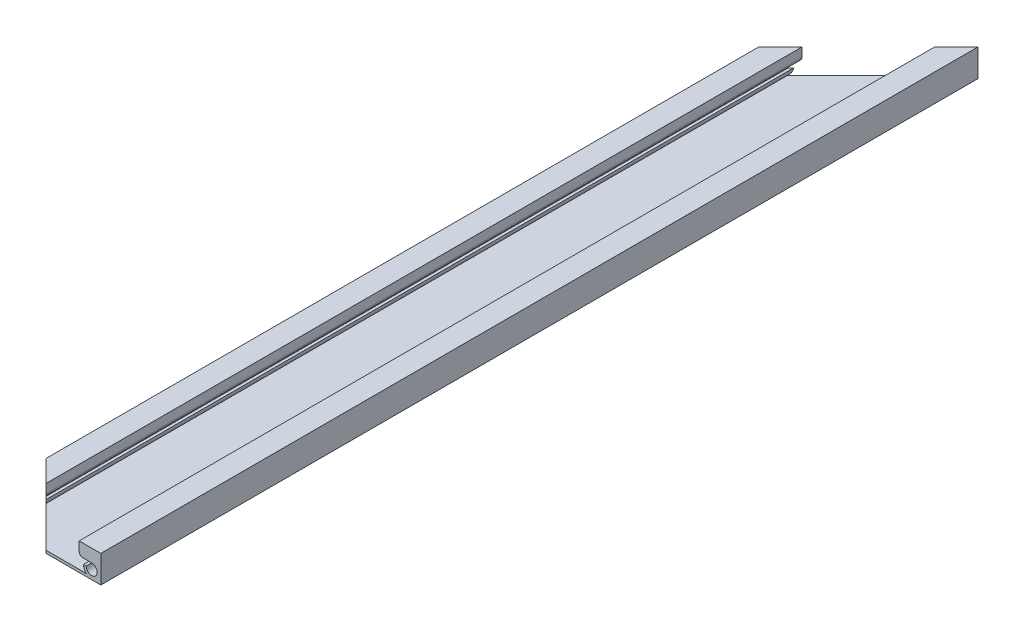
ISO-10303-21;
HEADER;
FILE_DESCRIPTION(('STEP AP214'),'2;1');
FILE_NAME('part.step','',(''),(''),'','','');
FILE_SCHEMA(('AUTOMOTIVE_DESIGN { 1 0 10303 214 1 1 1 1 }'));
ENDSEC;
DATA;
#1=APPLICATION_CONTEXT('core data for automotive mechanical design processes');
#2=APPLICATION_PROTOCOL_DEFINITION('international standard','automotive_design',2000,#1);
#3=PRODUCT_CONTEXT('',#1,'mechanical');
#4=PRODUCT('Part','Part','',(#3));
#5=PRODUCT_RELATED_PRODUCT_CATEGORY('part','',(#4));
#6=PRODUCT_DEFINITION_FORMATION('','',#4);
#7=PRODUCT_DEFINITION_CONTEXT('part definition',#1,'design');
#8=PRODUCT_DEFINITION('design','',#6,#7);
#9=PRODUCT_DEFINITION_SHAPE('','',#8);
#10=(LENGTH_UNIT() NAMED_UNIT(*) SI_UNIT(.MILLI.,.METRE.));
#11=(NAMED_UNIT(*) PLANE_ANGLE_UNIT() SI_UNIT($,.RADIAN.));
#12=(NAMED_UNIT(*) SI_UNIT($,.STERADIAN.) SOLID_ANGLE_UNIT());
#13=UNCERTAINTY_MEASURE_WITH_UNIT(LENGTH_MEASURE(1.E-05),#10,'distance_accuracy_value','');
#14=(GEOMETRIC_REPRESENTATION_CONTEXT(3) GLOBAL_UNCERTAINTY_ASSIGNED_CONTEXT((#13)) GLOBAL_UNIT_ASSIGNED_CONTEXT((#10,
#11,#12)) REPRESENTATION_CONTEXT('',''));
#15=CARTESIAN_POINT('',(0.,0.,0.));
#16=DIRECTION('',(0.,0.,1.));
#17=DIRECTION('',(1.,0.,0.));
#18=AXIS2_PLACEMENT_3D('',#15,#16,#17);
#19=CARTESIAN_POINT('',(-30.,7.5,510.));
#20=DIRECTION('',(0.,-1.,0.));
#21=DIRECTION('',(0.,0.,-1.));
#22=AXIS2_PLACEMENT_3D('',#19,#20,#21);
#23=PLANE('',#22);
#24=DIRECTION('',(0.707106781186546,0.,-0.707106781186549));
#25=VECTOR('',#24,1.);
#26=CARTESIAN_POINT('',(15.0000000000001,7.5,15.));
#27=LINE('',#26,#25);
#28=CARTESIAN_POINT('',(-30.,7.5,60.0000000000002));
#29=VERTEX_POINT('',#28);
#30=CARTESIAN_POINT('',(-18.1568883594902,7.5,48.1568883594904));
#31=VERTEX_POINT('',#30);
#32=EDGE_CURVE('E339',#29,#31,#27,.T.);
#33=ORIENTED_EDGE('',*,*,#32,.F.);
#34=DIRECTION('',(0.,0.,-1.));
#35=VECTOR('',#34,1.);
#36=CARTESIAN_POINT('',(-30.,7.5,510.));
#37=LINE('',#36,#35);
#38=CARTESIAN_POINT('',(-30.,7.5,450.));
#39=VERTEX_POINT('',#38);
#40=EDGE_CURVE('E202',#39,#29,#37,.T.);
#41=ORIENTED_EDGE('',*,*,#40,.F.);
#42=DIRECTION('',(0.707106781186546,0.,0.707106781186549));
#43=VECTOR('',#42,1.);
#44=CARTESIAN_POINT('',(-240.,7.5,239.999999999999));
#45=LINE('',#44,#43);
#46=CARTESIAN_POINT('',(-18.1568883594902,7.5,461.84311164051));
#47=VERTEX_POINT('',#46);
#48=EDGE_CURVE('E350',#39,#47,#45,.T.);
#49=ORIENTED_EDGE('',*,*,#48,.T.);
#50=DIRECTION('',(0.,0.,-1.));
#51=VECTOR('',#50,1.);
#52=CARTESIAN_POINT('',(-18.1568883594903,7.5,510.));
#53=LINE('',#52,#51);
#54=EDGE_CURVE('E288',#47,#31,#53,.T.);
#55=ORIENTED_EDGE('',*,*,#54,.T.);
#56=EDGE_LOOP('',(#33,#41,#49,#55));
#57=FACE_BOUND('',#56,.T.);
#58=ADVANCED_FACE('F43',(#57),#23,.F.);
#59=CARTESIAN_POINT('',(25.,0.5,510.));
#60=DIRECTION('',(0.,1.,0.));
#61=DIRECTION('',(-1.,0.,0.));
#62=AXIS2_PLACEMENT_3D('',#59,#60,#61);
#63=PLANE('',#62);
#64=DIRECTION('',(-0.707106781186546,0.,0.707106781186549));
#65=VECTOR('',#64,1.);
#66=CARTESIAN_POINT('',(-227.5,0.499999999999999,257.500000000001));
#67=LINE('',#66,#65);
#68=CARTESIAN_POINT('',(-20.1568883594903,0.5,50.1568883594905));
#69=VERTEX_POINT('',#68);
#70=CARTESIAN_POINT('',(-25.,0.5,55.0000000000003));
#71=VERTEX_POINT('',#70);
#72=EDGE_CURVE('E278',#69,#71,#67,.T.);
#73=ORIENTED_EDGE('',*,*,#72,.F.);
#74=DIRECTION('',(0.,0.,-1.));
#75=VECTOR('',#74,1.);
#76=CARTESIAN_POINT('',(-20.1568883594903,0.5,510.));
#77=LINE('',#76,#75);
#78=CARTESIAN_POINT('',(-20.1568883594903,0.5,459.84311164051));
#79=VERTEX_POINT('',#78);
#80=EDGE_CURVE('E221',#69,#79,#77,.F.);
#81=ORIENTED_EDGE('',*,*,#80,.T.);
#82=DIRECTION('',(-0.707106781186546,0.,-0.707106781186549));
#83=VECTOR('',#82,1.);
#84=CARTESIAN_POINT('',(27.5,0.5,507.5));
#85=LINE('',#84,#83);
#86=CARTESIAN_POINT('',(-25.,0.5,455.));
#87=VERTEX_POINT('',#86);
#88=EDGE_CURVE('E369',#79,#87,#85,.T.);
#89=ORIENTED_EDGE('',*,*,#88,.T.);
#90=DIRECTION('',(0.,0.,-1.));
#91=VECTOR('',#90,1.);
#92=CARTESIAN_POINT('',(-25.,0.5,510.));
#93=LINE('',#92,#91);
#94=EDGE_CURVE('E301',#87,#71,#93,.T.);
#95=ORIENTED_EDGE('',*,*,#94,.T.);
#96=EDGE_LOOP('',(#73,#81,#89,#95));
#97=FACE_BOUND('',#96,.T.);
#98=ADVANCED_FACE('F387',(#97),#63,.F.);
#99=DIRECTION('',(0.,0.,-1.));
#100=VECTOR('',#99,1.);
#101=CARTESIAN_POINT('',(18.1431116405097,7.5,510.));
#102=LINE('',#101,#100);
#103=CARTESIAN_POINT('',(18.1431116405097,7.5,480.));
#104=VERTEX_POINT('',#103);
#105=CARTESIAN_POINT('',(18.1431116405098,7.5,11.8568883594903));
#106=VERTEX_POINT('',#105);
#107=EDGE_CURVE('E193',#104,#106,#102,.T.);
#108=ORIENTED_EDGE('',*,*,#107,.F.);
#109=DIRECTION('',(1.,0.,0.));
#110=VECTOR('',#109,1.);
#111=CARTESIAN_POINT('',(30.,7.5,480.));
#112=LINE('',#111,#110);
#113=CARTESIAN_POINT('',(30.,7.5,480.));
#114=VERTEX_POINT('',#113);
#115=EDGE_CURVE('E177',#104,#114,#112,.T.);
#116=ORIENTED_EDGE('',*,*,#115,.T.);
#117=DIRECTION('',(0.,0.,-1.));
#118=VECTOR('',#117,1.);
#119=CARTESIAN_POINT('',(30.,7.5,510.));
#120=LINE('',#119,#118);
#121=CARTESIAN_POINT('',(30.,7.5,0.));
#122=VERTEX_POINT('',#121);
#123=EDGE_CURVE('E191',#114,#122,#120,.T.);
#124=ORIENTED_EDGE('',*,*,#123,.T.);
#125=EDGE_CURVE('E346',#106,#122,#27,.T.);
#126=ORIENTED_EDGE('',*,*,#125,.F.);
#127=EDGE_LOOP('',(#108,#116,#124,#126));
#128=FACE_BOUND('',#127,.T.);
#129=ADVANCED_FACE('F189',(#128),#23,.F.);
#130=CARTESIAN_POINT('',(-30.,7.5,510.));
#131=DIRECTION('',(1.,0.,0.));
#132=DIRECTION('',(0.,1.,0.));
#133=AXIS2_PLACEMENT_3D('',#130,#131,#132);
#134=PLANE('',#133);
#135=DIRECTION('',(0.,-1.,0.));
#136=VECTOR('',#135,1.);
#137=CARTESIAN_POINT('',(-30.,7.5,60.0000000000002));
#138=LINE('',#137,#136);
#139=CARTESIAN_POINT('',(-30.,-7.5,60.0000000000002));
#140=VERTEX_POINT('',#139);
#141=EDGE_CURVE('E335',#29,#140,#138,.T.);
#142=ORIENTED_EDGE('',*,*,#141,.T.);
#143=DIRECTION('',(0.,0.,-1.));
#144=VECTOR('',#143,1.);
#145=CARTESIAN_POINT('',(-30.,-7.5,510.));
#146=LINE('',#145,#144);
#147=CARTESIAN_POINT('',(-30.,-7.5,450.));
#148=VERTEX_POINT('',#147);
#149=EDGE_CURVE('E210',#148,#140,#146,.T.);
#150=ORIENTED_EDGE('',*,*,#149,.F.);
#151=DIRECTION('',(0.,-1.,0.));
#152=VECTOR('',#151,1.);
#153=CARTESIAN_POINT('',(-30.,7.5,450.));
#154=LINE('',#153,#152);
#155=EDGE_CURVE('E333',#39,#148,#154,.T.);
#156=ORIENTED_EDGE('',*,*,#155,.F.);
#157=ORIENTED_EDGE('',*,*,#40,.T.);
#158=EDGE_LOOP('',(#142,#150,#156,#157));
#159=FACE_BOUND('',#158,.T.);
#160=ADVANCED_FACE('F332',(#159),#134,.F.);
#161=CARTESIAN_POINT('',(-30.,-7.5,510.));
#162=DIRECTION('',(0.,1.,0.));
#163=DIRECTION('',(0.,0.,1.));
#164=AXIS2_PLACEMENT_3D('',#161,#162,#163);
#165=PLANE('',#164);
#166=DIRECTION('',(0.,0.,-1.));
#167=VECTOR('',#166,1.);
#168=CARTESIAN_POINT('',(30.,-7.5,510.));
#169=LINE('',#168,#167);
#170=CARTESIAN_POINT('',(30.,-7.5,480.));
#171=VERTEX_POINT('',#170);
#172=CARTESIAN_POINT('',(30.,-7.5,0.));
#173=VERTEX_POINT('',#172);
#174=EDGE_CURVE('E317',#171,#173,#169,.T.);
#175=ORIENTED_EDGE('',*,*,#174,.F.);
#176=DIRECTION('',(-1.,0.,0.));
#177=VECTOR('',#176,1.);
#178=CARTESIAN_POINT('',(-30.,-7.5,480.));
#179=LINE('',#178,#177);
#180=CARTESIAN_POINT('',(0.,-7.5,480.));
#181=VERTEX_POINT('',#180);
#182=EDGE_CURVE('E180',#171,#181,#179,.T.);
#183=ORIENTED_EDGE('',*,*,#182,.T.);
#184=DIRECTION('',(0.707106781186546,0.,0.707106781186549));
#185=VECTOR('',#184,1.);
#186=CARTESIAN_POINT('',(-240.,-7.5,239.999999999999));
#187=LINE('',#186,#185);
#188=EDGE_CURVE('E328',#148,#181,#187,.T.);
#189=ORIENTED_EDGE('',*,*,#188,.F.);
#190=ORIENTED_EDGE('',*,*,#149,.T.);
#191=DIRECTION('',(0.707106781186546,0.,-0.707106781186549));
#192=VECTOR('',#191,1.);
#193=CARTESIAN_POINT('',(15.0000000000001,-7.5,15.));
#194=LINE('',#193,#192);
#195=EDGE_CURVE('E326',#140,#173,#194,.T.);
#196=ORIENTED_EDGE('',*,*,#195,.T.);
#197=EDGE_LOOP('',(#175,#183,#189,#190,#196));
#198=FACE_BOUND('',#197,.T.);
#199=ADVANCED_FACE('F325',(#198),#165,.F.);
#200=CARTESIAN_POINT('',(-25.,-2.5,510.));
#201=DIRECTION('',(0.,0.,-1.));
#202=DIRECTION('',(-1.,0.,0.));
#203=AXIS2_PLACEMENT_3D('',#200,#201,#202);
#204=CYLINDRICAL_SURFACE('',#203,3.);
#205=CARTESIAN_POINT('',(-25.,-2.5,55.0000000000003));
#206=DIRECTION('',(-0.707106781186549,0.,-0.707106781186546));
#207=DIRECTION('',(0.707106781186546,0.,-0.707106781186549));
#208=AXIS2_PLACEMENT_3D('',#205,#206,#207);
#209=ELLIPSE('',#208,4.2426406871193,3.);
#210=CARTESIAN_POINT('',(-22.,-2.5,52.0000000000001));
#211=VERTEX_POINT('',#210);
#212=EDGE_CURVE('E275',#71,#211,#209,.F.);
#213=ORIENTED_EDGE('',*,*,#212,.F.);
#214=ORIENTED_EDGE('',*,*,#94,.F.);
#215=CARTESIAN_POINT('',(-25.,-2.5,455.));
#216=DIRECTION('',(0.707106781186549,0.,-0.707106781186546));
#217=DIRECTION('',(-0.707106781186546,0.,-0.707106781186549));
#218=AXIS2_PLACEMENT_3D('',#215,#216,#217);
#219=ELLIPSE('',#218,4.2426406871193,3.);
#220=CARTESIAN_POINT('',(-22.,-2.5,458.));
#221=VERTEX_POINT('',#220);
#222=EDGE_CURVE('E365',#87,#221,#219,.F.);
#223=ORIENTED_EDGE('',*,*,#222,.T.);
#224=DIRECTION('',(0.,0.,-1.));
#225=VECTOR('',#224,1.);
#226=CARTESIAN_POINT('',(-22.,-2.5,510.));
#227=LINE('',#226,#225);
#228=EDGE_CURVE('E207',#221,#211,#227,.T.);
#229=ORIENTED_EDGE('',*,*,#228,.T.);
#230=EDGE_LOOP('',(#213,#214,#223,#229));
#231=FACE_BOUND('',#230,.T.);
#232=ADVANCED_FACE('F390',(#231),#204,.F.);
#233=CARTESIAN_POINT('',(25.,-2.5,510.));
#234=DIRECTION('',(0.,0.,-1.));
#235=DIRECTION('',(-1.,0.,0.));
#236=AXIS2_PLACEMENT_3D('',#233,#234,#235);
#237=CYLINDRICAL_SURFACE('',#236,3.);
#238=DIRECTION('',(0.,0.,-1.));
#239=VECTOR('',#238,1.);
#240=CARTESIAN_POINT('',(22.,-2.5,510.));
#241=LINE('',#240,#239);
#242=CARTESIAN_POINT('',(22.,-2.5,8.00000000000001));
#243=VERTEX_POINT('',#242);
#244=CARTESIAN_POINT('',(22.,-2.5,480.));
#245=VERTEX_POINT('',#244);
#246=EDGE_CURVE('E201',#243,#245,#241,.F.);
#247=ORIENTED_EDGE('',*,*,#246,.T.);
#248=CARTESIAN_POINT('',(25.,-2.5,480.));
#249=DIRECTION('',(0.,0.,-1.));
#250=DIRECTION('',(-1.,0.,0.));
#251=AXIS2_PLACEMENT_3D('',#248,#249,#250);
#252=CIRCLE('',#251,3.);
#253=CARTESIAN_POINT('',(25.,0.5,480.));
#254=VERTEX_POINT('',#253);
#255=EDGE_CURVE('E420',#245,#254,#252,.F.);
#256=ORIENTED_EDGE('',*,*,#255,.T.);
#257=DIRECTION('',(0.,0.,-1.));
#258=VECTOR('',#257,1.);
#259=CARTESIAN_POINT('',(25.,0.5,510.));
#260=LINE('',#259,#258);
#261=CARTESIAN_POINT('',(25.,0.5,5.00000000000006));
#262=VERTEX_POINT('',#261);
#263=EDGE_CURVE('E298',#254,#262,#260,.T.);
#264=ORIENTED_EDGE('',*,*,#263,.T.);
#265=CARTESIAN_POINT('',(25.,-2.5,5.));
#266=DIRECTION('',(-0.707106781186549,0.,-0.707106781186546));
#267=DIRECTION('',(0.707106781186546,0.,-0.707106781186549));
#268=AXIS2_PLACEMENT_3D('',#265,#266,#267);
#269=ELLIPSE('',#268,4.2426406871193,3.);
#270=EDGE_CURVE('E249',#243,#262,#269,.F.);
#271=ORIENTED_EDGE('',*,*,#270,.F.);
#272=EDGE_LOOP('',(#247,#256,#264,#271));
#273=FACE_BOUND('',#272,.T.);
#274=ADVANCED_FACE('F419',(#273),#237,.F.);
#275=ORIENTED_EDGE('',*,*,#263,.F.);
#276=DIRECTION('',(-1.,0.,0.));
#277=VECTOR('',#276,1.);
#278=CARTESIAN_POINT('',(25.,0.5,480.));
#279=LINE('',#278,#277);
#280=CARTESIAN_POINT('',(20.1431116405097,0.5,480.));
#281=VERTEX_POINT('',#280);
#282=EDGE_CURVE('E423',#254,#281,#279,.T.);
#283=ORIENTED_EDGE('',*,*,#282,.T.);
#284=DIRECTION('',(0.,0.,-1.));
#285=VECTOR('',#284,1.);
#286=CARTESIAN_POINT('',(20.1431116405097,0.5,510.));
#287=LINE('',#286,#285);
#288=CARTESIAN_POINT('',(20.1431116405097,0.5,9.85688835949039));
#289=VERTEX_POINT('',#288);
#290=EDGE_CURVE('E66',#281,#289,#287,.T.);
#291=ORIENTED_EDGE('',*,*,#290,.T.);
#292=DIRECTION('',(-0.707106781186546,0.,0.707106781186549));
#293=VECTOR('',#292,1.);
#294=CARTESIAN_POINT('',(-227.5,0.499999999999999,257.500000000001));
#295=LINE('',#294,#293);
#296=EDGE_CURVE('E241',#262,#289,#295,.T.);
#297=ORIENTED_EDGE('',*,*,#296,.F.);
#298=EDGE_LOOP('',(#275,#283,#291,#297));
#299=FACE_BOUND('',#298,.T.);
#300=ADVANCED_FACE('F422',(#299),#63,.F.);
#301=CARTESIAN_POINT('',(-25.,-2.5,510.));
#302=DIRECTION('',(0.,-1.,0.));
#303=DIRECTION('',(1.,0.,0.));
#304=AXIS2_PLACEMENT_3D('',#301,#302,#303);
#305=PLANE('',#304);
#306=DIRECTION('',(0.707106781186546,0.,-0.707106781186549));
#307=VECTOR('',#306,1.);
#308=CARTESIAN_POINT('',(-252.5,-2.49999999999993,282.500000000001));
#309=LINE('',#308,#307);
#310=CARTESIAN_POINT('',(-20.5,-2.5,50.5000000000003));
#311=VERTEX_POINT('',#310);
#312=EDGE_CURVE('E272',#211,#311,#309,.T.);
#313=ORIENTED_EDGE('',*,*,#312,.F.);
#314=ORIENTED_EDGE('',*,*,#228,.F.);
#315=DIRECTION('',(0.707106781186546,0.,0.707106781186549));
#316=VECTOR('',#315,1.);
#317=CARTESIAN_POINT('',(2.50000000000011,-2.50000000000001,482.5));
#318=LINE('',#317,#316);
#319=CARTESIAN_POINT('',(-20.5,-2.5,459.5));
#320=VERTEX_POINT('',#319);
#321=EDGE_CURVE('E361',#221,#320,#318,.T.);
#322=ORIENTED_EDGE('',*,*,#321,.T.);
#323=DIRECTION('',(0.,0.,-1.));
#324=VECTOR('',#323,1.);
#325=CARTESIAN_POINT('',(-20.5,-2.5,510.));
#326=LINE('',#325,#324);
#327=EDGE_CURVE('E305',#320,#311,#326,.T.);
#328=ORIENTED_EDGE('',*,*,#327,.T.);
#329=EDGE_LOOP('',(#313,#314,#322,#328));
#330=FACE_BOUND('',#329,.T.);
#331=ADVANCED_FACE('F395',(#330),#305,.F.);
#332=CARTESIAN_POINT('',(20.5,-2.5,510.));
#333=DIRECTION('',(0.,-1.,0.));
#334=DIRECTION('',(1.,0.,0.));
#335=AXIS2_PLACEMENT_3D('',#332,#333,#334);
#336=PLANE('',#335);
#337=DIRECTION('',(0.,0.,-1.));
#338=VECTOR('',#337,1.);
#339=CARTESIAN_POINT('',(20.5,-2.5,510.));
#340=LINE('',#339,#338);
#341=CARTESIAN_POINT('',(20.5,-2.5,480.));
#342=VERTEX_POINT('',#341);
#343=CARTESIAN_POINT('',(20.5,-2.5,9.50000000000001));
#344=VERTEX_POINT('',#343);
#345=EDGE_CURVE('E295',#342,#344,#340,.T.);
#346=ORIENTED_EDGE('',*,*,#345,.F.);
#347=DIRECTION('',(1.,0.,0.));
#348=VECTOR('',#347,1.);
#349=CARTESIAN_POINT('',(20.5,-2.5,480.));
#350=LINE('',#349,#348);
#351=EDGE_CURVE('E416',#342,#245,#350,.T.);
#352=ORIENTED_EDGE('',*,*,#351,.T.);
#353=ORIENTED_EDGE('',*,*,#246,.F.);
#354=DIRECTION('',(0.707106781186546,0.,-0.707106781186549));
#355=VECTOR('',#354,1.);
#356=CARTESIAN_POINT('',(-229.75,-2.49999999999998,259.750000000001));
#357=LINE('',#356,#355);
#358=EDGE_CURVE('E258',#344,#243,#357,.T.);
#359=ORIENTED_EDGE('',*,*,#358,.F.);
#360=EDGE_LOOP('',(#346,#352,#353,#359));
#361=FACE_BOUND('',#360,.T.);
#362=ADVANCED_FACE('F414',(#361),#336,.F.);
#363=CARTESIAN_POINT('',(25.,-2.5,510.));
#364=DIRECTION('',(0.,0.,-1.));
#365=DIRECTION('',(-1.,0.,0.));
#366=AXIS2_PLACEMENT_3D('',#363,#364,#365);
#367=CYLINDRICAL_SURFACE('',#366,4.5);
#368=DIRECTION('',(0.,0.,-1.));
#369=VECTOR('',#368,1.);
#370=CARTESIAN_POINT('',(22.1715728752538,-6.,510.));
#371=LINE('',#370,#369);
#372=CARTESIAN_POINT('',(22.1715728752538,-6.,480.));
#373=VERTEX_POINT('',#372);
#374=CARTESIAN_POINT('',(22.1715728752538,-6.,7.82842712474618));
#375=VERTEX_POINT('',#374);
#376=EDGE_CURVE('E291',#373,#375,#371,.T.);
#377=ORIENTED_EDGE('',*,*,#376,.F.);
#378=CARTESIAN_POINT('',(25.,-2.5,480.));
#379=DIRECTION('',(0.,0.,-1.));
#380=DIRECTION('',(-1.,0.,0.));
#381=AXIS2_PLACEMENT_3D('',#378,#379,#380);
#382=CIRCLE('',#381,4.5);
#383=EDGE_CURVE('E408',#373,#342,#382,.T.);
#384=ORIENTED_EDGE('',*,*,#383,.T.);
#385=ORIENTED_EDGE('',*,*,#345,.T.);
#386=CARTESIAN_POINT('',(25.,-2.5,5.));
#387=DIRECTION('',(-0.707106781186549,0.,-0.707106781186546));
#388=DIRECTION('',(0.707106781186546,0.,-0.707106781186549));
#389=AXIS2_PLACEMENT_3D('',#386,#387,#388);
#390=ELLIPSE('',#389,6.36396103067894,4.5);
#391=EDGE_CURVE('E261',#375,#344,#390,.T.);
#392=ORIENTED_EDGE('',*,*,#391,.F.);
#393=EDGE_LOOP('',(#377,#384,#385,#392));
#394=FACE_BOUND('',#393,.T.);
#395=ADVANCED_FACE('F407',(#394),#367,.T.);
#396=CARTESIAN_POINT('',(-25.,-2.5,510.));
#397=DIRECTION('',(0.,0.,-1.));
#398=DIRECTION('',(-1.,0.,0.));
#399=AXIS2_PLACEMENT_3D('',#396,#397,#398);
#400=CYLINDRICAL_SURFACE('',#399,4.5);
#401=CARTESIAN_POINT('',(-25.,-2.5,55.0000000000003));
#402=DIRECTION('',(-0.707106781186549,0.,-0.707106781186546));
#403=DIRECTION('',(0.707106781186546,0.,-0.707106781186549));
#404=AXIS2_PLACEMENT_3D('',#401,#402,#403);
#405=ELLIPSE('',#404,6.36396103067895,4.5);
#406=CARTESIAN_POINT('',(-22.1715728752538,-6.,52.171572875254));
#407=VERTEX_POINT('',#406);
#408=EDGE_CURVE('E269',#311,#407,#405,.T.);
#409=ORIENTED_EDGE('',*,*,#408,.F.);
#410=ORIENTED_EDGE('',*,*,#327,.F.);
#411=CARTESIAN_POINT('',(-25.,-2.5,455.));
#412=DIRECTION('',(0.707106781186549,0.,-0.707106781186546));
#413=DIRECTION('',(-0.707106781186546,0.,-0.707106781186549));
#414=AXIS2_PLACEMENT_3D('',#411,#412,#413);
#415=ELLIPSE('',#414,6.36396103067895,4.5);
#416=CARTESIAN_POINT('',(-22.1715728752538,-6.,457.828427124746));
#417=VERTEX_POINT('',#416);
#418=EDGE_CURVE('E344',#320,#417,#415,.T.);
#419=ORIENTED_EDGE('',*,*,#418,.T.);
#420=DIRECTION('',(0.,0.,-1.));
#421=VECTOR('',#420,1.);
#422=CARTESIAN_POINT('',(-22.1715728752538,-6.,510.));
#423=LINE('',#422,#421);
#424=EDGE_CURVE('E309',#417,#407,#423,.T.);
#425=ORIENTED_EDGE('',*,*,#424,.T.);
#426=EDGE_LOOP('',(#409,#410,#419,#425));
#427=FACE_BOUND('',#426,.T.);
#428=ADVANCED_FACE('F398',(#427),#400,.T.);
#429=CARTESIAN_POINT('',(22.1715728752538,-6.,510.));
#430=DIRECTION('',(0.,-1.,0.));
#431=DIRECTION('',(0.,0.,-1.));
#432=AXIS2_PLACEMENT_3D('',#429,#430,#431);
#433=PLANE('',#432);
#434=DIRECTION('',(0.707106781186546,0.,0.707106781186549));
#435=VECTOR('',#434,1.);
#436=CARTESIAN_POINT('',(26.0857864376269,-6.,506.085786437627));
#437=LINE('',#436,#435);
#438=CARTESIAN_POINT('',(0.,-6.,480.));
#439=VERTEX_POINT('',#438);
#440=EDGE_CURVE('E338',#417,#439,#437,.T.);
#441=ORIENTED_EDGE('',*,*,#440,.T.);
#442=DIRECTION('',(1.,0.,0.));
#443=VECTOR('',#442,1.);
#444=CARTESIAN_POINT('',(22.1715728752538,-6.,480.));
#445=LINE('',#444,#443);
#446=EDGE_CURVE('E59',#439,#373,#445,.T.);
#447=ORIENTED_EDGE('',*,*,#446,.T.);
#448=ORIENTED_EDGE('',*,*,#376,.T.);
#449=DIRECTION('',(0.707106781186546,0.,-0.707106781186549));
#450=VECTOR('',#449,1.);
#451=CARTESIAN_POINT('',(-228.914213562373,-6.,258.914213562374));
#452=LINE('',#451,#450);
#453=EDGE_CURVE('E265',#407,#375,#452,.T.);
#454=ORIENTED_EDGE('',*,*,#453,.F.);
#455=ORIENTED_EDGE('',*,*,#424,.F.);
#456=EDGE_LOOP('',(#441,#447,#448,#454,#455));
#457=FACE_BOUND('',#456,.T.);
#458=ADVANCED_FACE('F403',(#457),#433,.F.);
#459=CARTESIAN_POINT('',(18.1431116405097,0.5,510.));
#460=DIRECTION('',(1.,0.,0.));
#461=DIRECTION('',(0.,0.,-1.));
#462=AXIS2_PLACEMENT_3D('',#459,#460,#461);
#463=PLANE('',#462);
#464=DIRECTION('',(0.,0.,-1.));
#465=VECTOR('',#464,1.);
#466=CARTESIAN_POINT('',(18.1431116405097,2.5,510.));
#467=LINE('',#466,#465);
#468=CARTESIAN_POINT('',(18.1431116405097,2.5,11.8568883594904));
#469=VERTEX_POINT('',#468);
#470=CARTESIAN_POINT('',(18.1431116405097,2.5,480.));
#471=VERTEX_POINT('',#470);
#472=EDGE_CURVE('E227',#469,#471,#467,.F.);
#473=ORIENTED_EDGE('',*,*,#472,.T.);
#474=DIRECTION('',(0.,1.,0.));
#475=VECTOR('',#474,1.);
#476=CARTESIAN_POINT('',(18.1431116405097,0.5,480.));
#477=LINE('',#476,#475);
#478=EDGE_CURVE('E425',#471,#104,#477,.T.);
#479=ORIENTED_EDGE('',*,*,#478,.T.);
#480=ORIENTED_EDGE('',*,*,#107,.T.);
#481=DIRECTION('',(0.,1.,0.));
#482=VECTOR('',#481,1.);
#483=CARTESIAN_POINT('',(18.1431116405097,0.5,11.8568883594903));
#484=LINE('',#483,#482);
#485=EDGE_CURVE('E239',#469,#106,#484,.T.);
#486=ORIENTED_EDGE('',*,*,#485,.F.);
#487=EDGE_LOOP('',(#473,#479,#480,#486));
#488=FACE_BOUND('',#487,.T.);
#489=ADVANCED_FACE('F243',(#488),#463,.F.);
#490=CARTESIAN_POINT('',(-18.1568883594903,7.5,510.));
#491=DIRECTION('',(-1.,0.,0.));
#492=DIRECTION('',(0.,0.,1.));
#493=AXIS2_PLACEMENT_3D('',#490,#491,#492);
#494=PLANE('',#493);
#495=DIRECTION('',(0.,-1.,0.));
#496=VECTOR('',#495,1.);
#497=CARTESIAN_POINT('',(-18.1568883594903,7.5,48.1568883594905));
#498=LINE('',#497,#496);
#499=CARTESIAN_POINT('',(-18.1568883594903,2.5,48.1568883594906));
#500=VERTEX_POINT('',#499);
#501=EDGE_CURVE('E285',#31,#500,#498,.T.);
#502=ORIENTED_EDGE('',*,*,#501,.F.);
#503=ORIENTED_EDGE('',*,*,#54,.F.);
#504=DIRECTION('',(0.,-1.,0.));
#505=VECTOR('',#504,1.);
#506=CARTESIAN_POINT('',(-18.1568883594903,7.5,461.84311164051));
#507=LINE('',#506,#505);
#508=CARTESIAN_POINT('',(-18.1568883594903,2.5,461.84311164051));
#509=VERTEX_POINT('',#508);
#510=EDGE_CURVE('E245',#47,#509,#507,.T.);
#511=ORIENTED_EDGE('',*,*,#510,.T.);
#512=DIRECTION('',(0.,0.,-1.));
#513=VECTOR('',#512,1.);
#514=CARTESIAN_POINT('',(-18.1568883594903,2.5,510.));
#515=LINE('',#514,#513);
#516=EDGE_CURVE('E217',#509,#500,#515,.T.);
#517=ORIENTED_EDGE('',*,*,#516,.T.);
#518=EDGE_LOOP('',(#502,#503,#511,#517));
#519=FACE_BOUND('',#518,.T.);
#520=ADVANCED_FACE('F382',(#519),#494,.F.);
#521=CARTESIAN_POINT('',(-20.1568883594903,2.5,510.));
#522=DIRECTION('',(0.,0.,-1.));
#523=DIRECTION('',(-1.,0.,0.));
#524=AXIS2_PLACEMENT_3D('',#521,#522,#523);
#525=CYLINDRICAL_SURFACE('',#524,2.);
#526=ORIENTED_EDGE('',*,*,#80,.F.);
#527=CARTESIAN_POINT('',(-20.1568883594903,2.5,50.1568883594906));
#528=DIRECTION('',(-0.707106781186549,0.,-0.707106781186546));
#529=DIRECTION('',(0.707106781186546,0.,-0.707106781186549));
#530=AXIS2_PLACEMENT_3D('',#527,#528,#529);
#531=ELLIPSE('',#530,2.8284271247462,2.);
#532=EDGE_CURVE('E281',#69,#500,#531,.F.);
#533=ORIENTED_EDGE('',*,*,#532,.T.);
#534=ORIENTED_EDGE('',*,*,#516,.F.);
#535=CARTESIAN_POINT('',(-20.1568883594903,2.5,459.84311164051));
#536=DIRECTION('',(0.707106781186549,0.,-0.707106781186546));
#537=DIRECTION('',(-0.707106781186546,0.,-0.707106781186549));
#538=AXIS2_PLACEMENT_3D('',#535,#536,#537);
#539=ELLIPSE('',#538,2.8284271247462,2.);
#540=EDGE_CURVE('E252',#79,#509,#539,.F.);
#541=ORIENTED_EDGE('',*,*,#540,.F.);
#542=EDGE_LOOP('',(#526,#533,#534,#541));
#543=FACE_BOUND('',#542,.T.);
#544=ADVANCED_FACE('F383',(#543),#525,.T.);
#545=CARTESIAN_POINT('',(20.1431116405097,2.5,510.));
#546=DIRECTION('',(0.,0.,-1.));
#547=DIRECTION('',(-1.,0.,0.));
#548=AXIS2_PLACEMENT_3D('',#545,#546,#547);
#549=CYLINDRICAL_SURFACE('',#548,2.);
#550=CARTESIAN_POINT('',(20.1431116405097,2.5,480.));
#551=DIRECTION('',(0.,0.,-1.));
#552=DIRECTION('',(-1.,0.,0.));
#553=AXIS2_PLACEMENT_3D('',#550,#551,#552);
#554=CIRCLE('',#553,2.);
#555=EDGE_CURVE('E185',#471,#281,#554,.F.);
#556=ORIENTED_EDGE('',*,*,#555,.F.);
#557=ORIENTED_EDGE('',*,*,#472,.F.);
#558=CARTESIAN_POINT('',(20.1431116405097,2.5,9.85688835949039));
#559=DIRECTION('',(-0.707106781186549,0.,-0.707106781186546));
#560=DIRECTION('',(0.707106781186546,0.,-0.707106781186549));
#561=AXIS2_PLACEMENT_3D('',#558,#559,#560);
#562=ELLIPSE('',#561,2.8284271247462,2.);
#563=EDGE_CURVE('E52',#469,#289,#562,.F.);
#564=ORIENTED_EDGE('',*,*,#563,.T.);
#565=ORIENTED_EDGE('',*,*,#290,.F.);
#566=EDGE_LOOP('',(#556,#557,#564,#565));
#567=FACE_BOUND('',#566,.T.);
#568=ADVANCED_FACE('F45',(#567),#549,.T.);
#569=CARTESIAN_POINT('',(30.,7.5,510.));
#570=DIRECTION('',(-1.,0.,0.));
#571=DIRECTION('',(0.,-1.,0.));
#572=AXIS2_PLACEMENT_3D('',#569,#570,#571);
#573=PLANE('',#572);
#574=ORIENTED_EDGE('',*,*,#123,.F.);
#575=DIRECTION('',(0.,-1.,0.));
#576=VECTOR('',#575,1.);
#577=CARTESIAN_POINT('',(30.,7.5,480.));
#578=LINE('',#577,#576);
#579=EDGE_CURVE('E174',#114,#171,#578,.T.);
#580=ORIENTED_EDGE('',*,*,#579,.T.);
#581=ORIENTED_EDGE('',*,*,#174,.T.);
#582=DIRECTION('',(0.,1.,0.));
#583=VECTOR('',#582,1.);
#584=CARTESIAN_POINT('',(30.,7.5,0.));
#585=LINE('',#584,#583);
#586=EDGE_CURVE('E199',#173,#122,#585,.T.);
#587=ORIENTED_EDGE('',*,*,#586,.T.);
#588=EDGE_LOOP('',(#574,#580,#581,#587));
#589=FACE_BOUND('',#588,.T.);
#590=ADVANCED_FACE('F197',(#589),#573,.F.);
#591=CARTESIAN_POINT('',(-240.,7.5,239.999999999999));
#592=DIRECTION('',(0.707106781186549,0.,-0.707106781186546));
#593=DIRECTION('',(-0.707106781186546,0.,-0.707106781186549));
#594=AXIS2_PLACEMENT_3D('',#591,#592,#593);
#595=PLANE('',#594);
#596=ORIENTED_EDGE('',*,*,#188,.T.);
#597=DIRECTION('',(0.,1.,0.));
#598=VECTOR('',#597,1.);
#599=CARTESIAN_POINT('',(0.,7.5,480.));
#600=LINE('',#599,#598);
#601=EDGE_CURVE('E11',#181,#439,#600,.T.);
#602=ORIENTED_EDGE('',*,*,#601,.T.);
#603=ORIENTED_EDGE('',*,*,#440,.F.);
#604=ORIENTED_EDGE('',*,*,#418,.F.);
#605=ORIENTED_EDGE('',*,*,#321,.F.);
#606=ORIENTED_EDGE('',*,*,#222,.F.);
#607=ORIENTED_EDGE('',*,*,#88,.F.);
#608=ORIENTED_EDGE('',*,*,#540,.T.);
#609=ORIENTED_EDGE('',*,*,#510,.F.);
#610=ORIENTED_EDGE('',*,*,#48,.F.);
#611=ORIENTED_EDGE('',*,*,#155,.T.);
#612=EDGE_LOOP('',(#596,#602,#603,#604,#605,#606,#607,#608,#609,#610,#611));
#613=FACE_BOUND('',#612,.T.);
#614=ADVANCED_FACE('F375',(#613),#595,.F.);
#615=CARTESIAN_POINT('',(15.0000000000001,7.5,15.));
#616=DIRECTION('',(-0.707106781186549,0.,-0.707106781186546));
#617=DIRECTION('',(-0.707106781186546,0.,0.707106781186549));
#618=AXIS2_PLACEMENT_3D('',#615,#616,#617);
#619=PLANE('',#618);
#620=ORIENTED_EDGE('',*,*,#501,.T.);
#621=ORIENTED_EDGE('',*,*,#532,.F.);
#622=ORIENTED_EDGE('',*,*,#72,.T.);
#623=ORIENTED_EDGE('',*,*,#212,.T.);
#624=ORIENTED_EDGE('',*,*,#312,.T.);
#625=ORIENTED_EDGE('',*,*,#408,.T.);
#626=ORIENTED_EDGE('',*,*,#453,.T.);
#627=ORIENTED_EDGE('',*,*,#391,.T.);
#628=ORIENTED_EDGE('',*,*,#358,.T.);
#629=ORIENTED_EDGE('',*,*,#270,.T.);
#630=ORIENTED_EDGE('',*,*,#296,.T.);
#631=ORIENTED_EDGE('',*,*,#563,.F.);
#632=ORIENTED_EDGE('',*,*,#485,.T.);
#633=ORIENTED_EDGE('',*,*,#125,.T.);
#634=ORIENTED_EDGE('',*,*,#586,.F.);
#635=ORIENTED_EDGE('',*,*,#195,.F.);
#636=ORIENTED_EDGE('',*,*,#141,.F.);
#637=ORIENTED_EDGE('',*,*,#32,.T.);
#638=EDGE_LOOP('',(#620,#621,#622,#623,#624,#625,#626,#627,#628,#629,#630,#631,#632,#633,#634,
#635,#636,#637));
#639=FACE_BOUND('',#638,.T.);
#640=ADVANCED_FACE('F238',(#639),#619,.T.);
#641=CARTESIAN_POINT('',(30.,7.5,480.));
#642=DIRECTION('',(0.,0.,-1.));
#643=DIRECTION('',(-1.,0.,0.));
#644=AXIS2_PLACEMENT_3D('',#641,#642,#643);
#645=PLANE('',#644);
#646=ORIENTED_EDGE('',*,*,#579,.F.);
#647=ORIENTED_EDGE('',*,*,#115,.F.);
#648=ORIENTED_EDGE('',*,*,#478,.F.);
#649=ORIENTED_EDGE('',*,*,#555,.T.);
#650=ORIENTED_EDGE('',*,*,#282,.F.);
#651=ORIENTED_EDGE('',*,*,#255,.F.);
#652=ORIENTED_EDGE('',*,*,#351,.F.);
#653=ORIENTED_EDGE('',*,*,#383,.F.);
#654=ORIENTED_EDGE('',*,*,#446,.F.);
#655=ORIENTED_EDGE('',*,*,#601,.F.);
#656=ORIENTED_EDGE('',*,*,#182,.F.);
#657=EDGE_LOOP('',(#646,#647,#648,#649,#650,#651,#652,#653,#654,#655,#656));
#658=FACE_BOUND('',#657,.T.);
#659=ADVANCED_FACE('F176',(#658),#645,.F.);
#660=CLOSED_SHELL('',(#58,#98,#129,#160,#199,#232,#274,#300,#331,#362,#395,#428,#458,#489,#520,
#544,#568,#590,#614,#640,#659));
#661=MANIFOLD_SOLID_BREP('B2',#660);
#662=ADVANCED_BREP_SHAPE_REPRESENTATION('',(#18,#661),#14);
#663=SHAPE_DEFINITION_REPRESENTATION(#9,#662);
ENDSEC;
END-ISO-10303-21;
